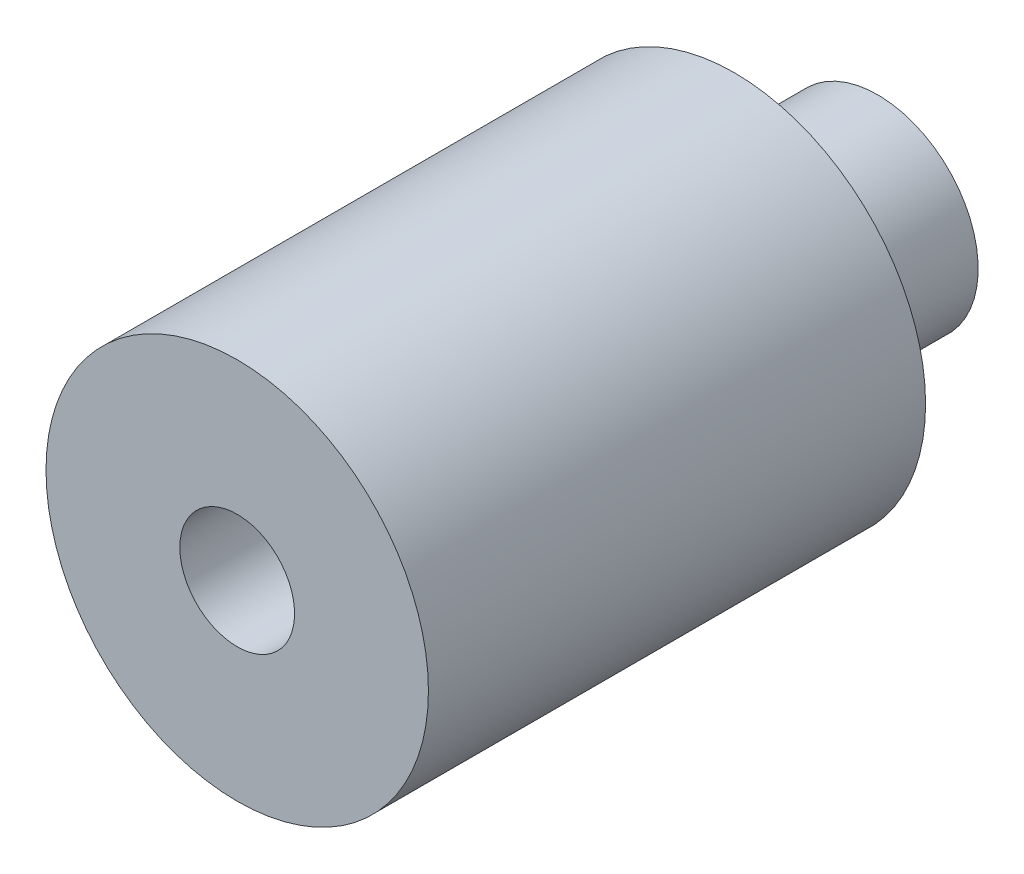
ISO-10303-21;
HEADER;
FILE_DESCRIPTION(('STEP AP214'),'2;1');
FILE_NAME('part.step','',(''),(''),'','','');
FILE_SCHEMA(('AUTOMOTIVE_DESIGN { 1 0 10303 214 1 1 1 1 }'));
ENDSEC;
DATA;
#1=APPLICATION_CONTEXT('core data for automotive mechanical design processes');
#2=APPLICATION_PROTOCOL_DEFINITION('international standard','automotive_design',2000,#1);
#3=PRODUCT_CONTEXT('',#1,'mechanical');
#4=PRODUCT('Part','Part','',(#3));
#5=PRODUCT_RELATED_PRODUCT_CATEGORY('part','',(#4));
#6=PRODUCT_DEFINITION_FORMATION('','',#4);
#7=PRODUCT_DEFINITION_CONTEXT('part definition',#1,'design');
#8=PRODUCT_DEFINITION('design','',#6,#7);
#9=PRODUCT_DEFINITION_SHAPE('','',#8);
#10=(LENGTH_UNIT() NAMED_UNIT(*) SI_UNIT(.MILLI.,.METRE.));
#11=(NAMED_UNIT(*) PLANE_ANGLE_UNIT() SI_UNIT($,.RADIAN.));
#12=(NAMED_UNIT(*) SI_UNIT($,.STERADIAN.) SOLID_ANGLE_UNIT());
#13=UNCERTAINTY_MEASURE_WITH_UNIT(LENGTH_MEASURE(1.E-05),#10,'distance_accuracy_value','');
#14=(GEOMETRIC_REPRESENTATION_CONTEXT(3) GLOBAL_UNCERTAINTY_ASSIGNED_CONTEXT((#13)) GLOBAL_UNIT_ASSIGNED_CONTEXT((#10,
#11,#12)) REPRESENTATION_CONTEXT('',''));
#15=CARTESIAN_POINT('',(0.,0.,0.));
#16=DIRECTION('',(0.,0.,1.));
#17=DIRECTION('',(1.,0.,0.));
#18=AXIS2_PLACEMENT_3D('',#15,#16,#17);
#19=CARTESIAN_POINT('',(0.,0.,26.));
#20=DIRECTION('',(0.,0.,-1.));
#21=DIRECTION('',(-1.,0.,0.));
#22=AXIS2_PLACEMENT_3D('',#19,#20,#21);
#23=CYLINDRICAL_SURFACE('',#22,10.);
#24=CARTESIAN_POINT('',(0.,0.,26.));
#25=DIRECTION('',(0.,0.,1.));
#26=DIRECTION('',(1.,0.,0.));
#27=AXIS2_PLACEMENT_3D('',#24,#25,#26);
#28=CIRCLE('',#27,10.);
#29=CARTESIAN_POINT('',(-10.,0.,26.));
#30=VERTEX_POINT('',#29);
#31=EDGE_CURVE('E49',#30,#30,#28,.T.);
#32=CARTESIAN_POINT('',(0.,0.,0.));
#33=DIRECTION('',(0.,0.,1.));
#34=DIRECTION('',(1.,0.,0.));
#35=AXIS2_PLACEMENT_3D('',#32,#33,#34);
#36=CIRCLE('',#35,10.);
#37=CARTESIAN_POINT('',(-10.,0.,0.));
#38=VERTEX_POINT('',#37);
#39=EDGE_CURVE('E44',#38,#38,#36,.T.);
#40=CARTESIAN_POINT('',(-10.,0.,26.));
#41=CARTESIAN_POINT('',(-10.,0.,25.7291666666667));
#42=CARTESIAN_POINT('',(-10.,0.,25.4583333333333));
#43=CARTESIAN_POINT('',(-10.,0.,24.9166666666667));
#44=CARTESIAN_POINT('',(-10.,0.,24.6458333333333));
#45=CARTESIAN_POINT('',(-10.,0.,24.1041666666667));
#46=CARTESIAN_POINT('',(-10.,0.,23.8333333333333));
#47=CARTESIAN_POINT('',(-10.,0.,23.2916666666667));
#48=CARTESIAN_POINT('',(-10.,0.,23.0208333333333));
#49=CARTESIAN_POINT('',(-10.,0.,22.4791666666667));
#50=CARTESIAN_POINT('',(-10.,0.,22.2083333333333));
#51=CARTESIAN_POINT('',(-10.,0.,21.6666666666667));
#52=CARTESIAN_POINT('',(-10.,0.,21.3958333333333));
#53=CARTESIAN_POINT('',(-10.,0.,20.8541666666667));
#54=CARTESIAN_POINT('',(-10.,0.,20.5833333333333));
#55=CARTESIAN_POINT('',(-10.,0.,20.0416666666667));
#56=CARTESIAN_POINT('',(-10.,0.,19.7708333333333));
#57=CARTESIAN_POINT('',(-10.,0.,19.2291666666667));
#58=CARTESIAN_POINT('',(-10.,0.,18.9583333333333));
#59=CARTESIAN_POINT('',(-10.,0.,18.4166666666667));
#60=CARTESIAN_POINT('',(-10.,0.,18.1458333333333));
#61=CARTESIAN_POINT('',(-10.,0.,17.6041666666667));
#62=CARTESIAN_POINT('',(-10.,0.,17.3333333333333));
#63=CARTESIAN_POINT('',(-10.,0.,16.7916666666667));
#64=CARTESIAN_POINT('',(-10.,0.,16.5208333333333));
#65=CARTESIAN_POINT('',(-10.,0.,15.9791666666667));
#66=CARTESIAN_POINT('',(-10.,0.,15.7083333333333));
#67=CARTESIAN_POINT('',(-10.,0.,15.1666666666667));
#68=CARTESIAN_POINT('',(-10.,0.,14.8958333333333));
#69=CARTESIAN_POINT('',(-10.,0.,14.3541666666667));
#70=CARTESIAN_POINT('',(-10.,0.,14.0833333333333));
#71=CARTESIAN_POINT('',(-10.,0.,13.5416666666667));
#72=CARTESIAN_POINT('',(-10.,0.,13.2708333333333));
#73=CARTESIAN_POINT('',(-10.,0.,12.7291666666667));
#74=CARTESIAN_POINT('',(-10.,0.,12.4583333333333));
#75=CARTESIAN_POINT('',(-10.,0.,11.9166666666667));
#76=CARTESIAN_POINT('',(-10.,0.,11.6458333333333));
#77=CARTESIAN_POINT('',(-10.,0.,11.1041666666667));
#78=CARTESIAN_POINT('',(-10.,0.,10.8333333333333));
#79=CARTESIAN_POINT('',(-10.,0.,10.2916666666667));
#80=CARTESIAN_POINT('',(-10.,0.,10.0208333333333));
#81=CARTESIAN_POINT('',(-10.,0.,9.47916666666667));
#82=CARTESIAN_POINT('',(-10.,0.,9.20833333333333));
#83=CARTESIAN_POINT('',(-10.,0.,8.66666666666667));
#84=CARTESIAN_POINT('',(-10.,0.,8.39583333333333));
#85=CARTESIAN_POINT('',(-10.,0.,7.85416666666667));
#86=CARTESIAN_POINT('',(-10.,0.,7.58333333333333));
#87=CARTESIAN_POINT('',(-10.,0.,7.04166666666667));
#88=CARTESIAN_POINT('',(-10.,0.,6.77083333333333));
#89=CARTESIAN_POINT('',(-10.,0.,6.22916666666667));
#90=CARTESIAN_POINT('',(-10.,0.,5.95833333333333));
#91=CARTESIAN_POINT('',(-10.,0.,5.41666666666667));
#92=CARTESIAN_POINT('',(-10.,0.,5.14583333333333));
#93=CARTESIAN_POINT('',(-10.,0.,4.60416666666667));
#94=CARTESIAN_POINT('',(-10.,0.,4.33333333333333));
#95=CARTESIAN_POINT('',(-10.,0.,3.79166666666667));
#96=CARTESIAN_POINT('',(-10.,0.,3.52083333333333));
#97=CARTESIAN_POINT('',(-10.,0.,2.97916666666667));
#98=CARTESIAN_POINT('',(-10.,0.,2.70833333333333));
#99=CARTESIAN_POINT('',(-10.,0.,2.16666666666667));
#100=CARTESIAN_POINT('',(-10.,0.,1.89583333333333));
#101=CARTESIAN_POINT('',(-10.,0.,1.35416666666667));
#102=CARTESIAN_POINT('',(-10.,0.,1.08333333333333));
#103=CARTESIAN_POINT('',(-10.,0.,0.541666666666667));
#104=CARTESIAN_POINT('',(-10.,0.,0.270833333333334));
#105=CARTESIAN_POINT('',(-10.,0.,0.));
#106=B_SPLINE_CURVE_WITH_KNOTS('',3,(#40,#41,#42,#43,#44,#45,#46,#47,#48,#49,#50,#51,#52,#53,
#54,#55,#56,#57,#58,#59,#60,#61,#62,#63,#64,#65,#66,#67,#68,#69,#70,#71,#72,#73,#74,#75,#76,#77,
#78,#79,#80,#81,#82,#83,#84,#85,#86,#87,#88,#89,#90,#91,#92,#93,#94,#95,#96,#97,#98,#99,#100,
#101,#102,#103,#104,#105),.UNSPECIFIED.,.F.,.F.,(4,2,2,2,2,2,2,2,2,2,2,2,2,2,2,2,2,2,2,2,2,2,2,
2,2,2,2,2,2,2,2,2,4),(0.,0.812499999999997,1.625,2.4375,3.25,4.0625,4.875,5.6875,6.5,7.3125,
8.125,8.93749999999999,9.74999999999999,10.5625,11.375,12.1875,13.,13.8125,14.625,15.4375,16.25,
17.0625,17.875,18.6875,19.5,20.3125,21.125,21.9375,22.75,23.5625,24.375,25.1875,26.),.UNSPECIFIED.);
#107=EDGE_CURVE('BSEAM41',#30,#38,#106,.T.);
#108=ORIENTED_EDGE('',*,*,#31,.F.);
#109=ORIENTED_EDGE('',*,*,#39,.T.);
#110=ORIENTED_EDGE('',*,*,#107,.T.);
#111=ORIENTED_EDGE('',*,*,#107,.F.);
#112=EDGE_LOOP('',(#108,#110,#109,#111));
#113=FACE_BOUND('',#112,.T.);
#114=ADVANCED_FACE('F41',(#113),#23,.T.);
#115=CARTESIAN_POINT('',(0.,0.,26.));
#116=DIRECTION('',(0.,0.,1.));
#117=DIRECTION('',(1.,0.,0.));
#118=AXIS2_PLACEMENT_3D('',#115,#116,#117);
#119=PLANE('',#118);
#120=CARTESIAN_POINT('',(0.,0.,26.));
#121=DIRECTION('',(0.,0.,-1.));
#122=DIRECTION('',(-1.,0.,0.));
#123=AXIS2_PLACEMENT_3D('',#120,#121,#122);
#124=CIRCLE('',#123,3.);
#125=CARTESIAN_POINT('',(-3.,0.,26.));
#126=VERTEX_POINT('',#125);
#127=EDGE_CURVE('E60',#126,#126,#124,.T.);
#128=ORIENTED_EDGE('',*,*,#127,.T.);
#129=EDGE_LOOP('',(#128));
#130=FACE_BOUND('',#129,.T.);
#131=ORIENTED_EDGE('',*,*,#31,.T.);
#132=EDGE_LOOP('',(#131));
#133=FACE_BOUND('',#132,.T.);
#134=ADVANCED_FACE('F69',(#130,#133),#119,.T.);
#135=CARTESIAN_POINT('',(0.,0.,0.));
#136=DIRECTION('',(0.,0.,1.));
#137=DIRECTION('',(1.,0.,0.));
#138=AXIS2_PLACEMENT_3D('',#135,#136,#137);
#139=PLANE('',#138);
#140=CARTESIAN_POINT('',(0.,0.,0.));
#141=DIRECTION('',(0.,0.,-1.));
#142=DIRECTION('',(-1.,0.,0.));
#143=AXIS2_PLACEMENT_3D('',#140,#141,#142);
#144=CIRCLE('',#143,5.25);
#145=CARTESIAN_POINT('',(-5.25,0.,0.));
#146=VERTEX_POINT('',#145);
#147=EDGE_CURVE('E10',#146,#146,#144,.T.);
#148=ORIENTED_EDGE('',*,*,#147,.F.);
#149=EDGE_LOOP('',(#148));
#150=FACE_BOUND('',#149,.T.);
#151=ORIENTED_EDGE('',*,*,#39,.F.);
#152=EDGE_LOOP('',(#151));
#153=FACE_BOUND('',#152,.T.);
#154=ADVANCED_FACE('F86',(#150,#153),#139,.F.);
#155=CARTESIAN_POINT('',(0.,0.,-7.5));
#156=DIRECTION('',(0.,0.,1.));
#157=DIRECTION('',(1.,0.,0.));
#158=AXIS2_PLACEMENT_3D('',#155,#156,#157);
#159=CYLINDRICAL_SURFACE('',#158,5.25);
#160=CARTESIAN_POINT('',(0.,0.,-7.5));
#161=DIRECTION('',(0.,0.,-1.));
#162=DIRECTION('',(-1.,0.,0.));
#163=AXIS2_PLACEMENT_3D('',#160,#161,#162);
#164=CIRCLE('',#163,5.25);
#165=CARTESIAN_POINT('',(-5.25,0.,-7.5));
#166=VERTEX_POINT('',#165);
#167=EDGE_CURVE('E56',#166,#166,#164,.T.);
#168=ORIENTED_EDGE('',*,*,#167,.F.);
#169=EDGE_LOOP('',(#168));
#170=FACE_BOUND('',#169,.T.);
#171=ORIENTED_EDGE('',*,*,#147,.T.);
#172=EDGE_LOOP('',(#171));
#173=FACE_BOUND('',#172,.T.);
#174=ADVANCED_FACE('F81',(#170,#173),#159,.T.);
#175=CARTESIAN_POINT('',(0.,0.,-7.5));
#176=DIRECTION('',(0.,0.,-1.));
#177=DIRECTION('',(-1.,0.,0.));
#178=AXIS2_PLACEMENT_3D('',#175,#176,#177);
#179=PLANE('',#178);
#180=CARTESIAN_POINT('',(0.,0.,-7.5));
#181=DIRECTION('',(0.,0.,-1.));
#182=DIRECTION('',(-1.,0.,0.));
#183=AXIS2_PLACEMENT_3D('',#180,#181,#182);
#184=CIRCLE('',#183,3.);
#185=CARTESIAN_POINT('',(-3.,0.,-7.5));
#186=VERTEX_POINT('',#185);
#187=EDGE_CURVE('E61',#186,#186,#184,.T.);
#188=ORIENTED_EDGE('',*,*,#187,.F.);
#189=EDGE_LOOP('',(#188));
#190=FACE_BOUND('',#189,.T.);
#191=ORIENTED_EDGE('',*,*,#167,.T.);
#192=EDGE_LOOP('',(#191));
#193=FACE_BOUND('',#192,.T.);
#194=ADVANCED_FACE('F75',(#190,#193),#179,.T.);
#195=CARTESIAN_POINT('',(0.,0.,26.));
#196=DIRECTION('',(0.,0.,-1.));
#197=DIRECTION('',(-1.,0.,0.));
#198=AXIS2_PLACEMENT_3D('',#195,#196,#197);
#199=CYLINDRICAL_SURFACE('',#198,3.);
#200=ORIENTED_EDGE('',*,*,#127,.F.);
#201=EDGE_LOOP('',(#200));
#202=FACE_BOUND('',#201,.T.);
#203=ORIENTED_EDGE('',*,*,#187,.T.);
#204=EDGE_LOOP('',(#203));
#205=FACE_BOUND('',#204,.T.);
#206=ADVANCED_FACE('F72',(#202,#205),#199,.F.);
#207=CLOSED_SHELL('',(#114,#134,#154,#174,#194,#206));
#208=MANIFOLD_SOLID_BREP('B2',#207);
#209=ADVANCED_BREP_SHAPE_REPRESENTATION('',(#18,#208),#14);
#210=SHAPE_DEFINITION_REPRESENTATION(#9,#209);
ENDSEC;
END-ISO-10303-21;
